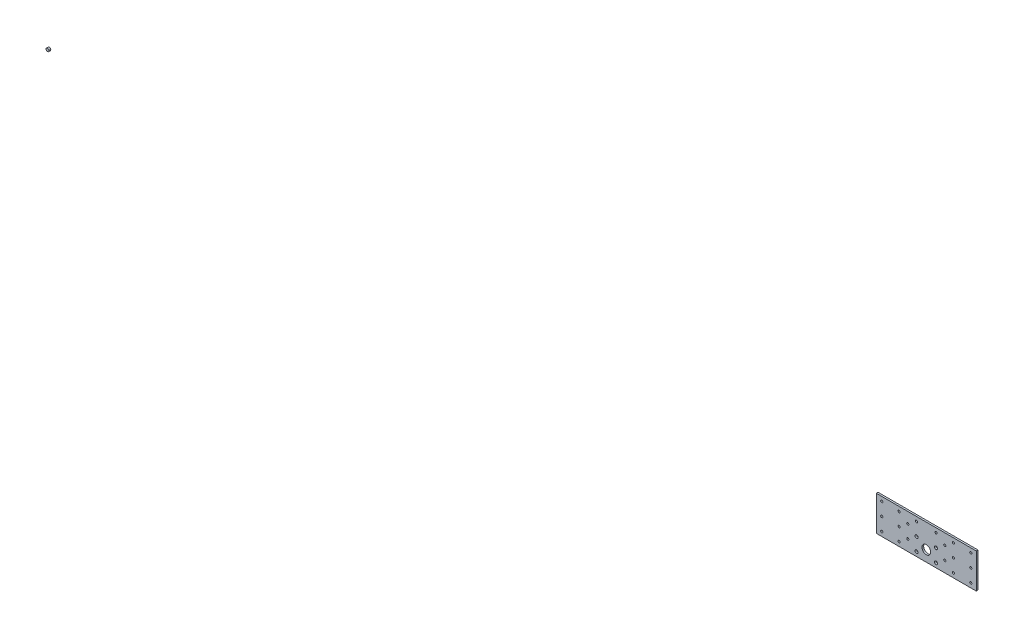
ISO-10303-21;
HEADER;
FILE_DESCRIPTION(('STEP AP214'),'2;1');
FILE_NAME('part.step','',(''),(''),'','','');
FILE_SCHEMA(('AUTOMOTIVE_DESIGN { 1 0 10303 214 1 1 1 1 }'));
ENDSEC;
DATA;
#1=APPLICATION_CONTEXT('core data for automotive mechanical design processes');
#2=APPLICATION_PROTOCOL_DEFINITION('international standard','automotive_design',2000,#1);
#3=PRODUCT_CONTEXT('',#1,'mechanical');
#4=PRODUCT('Part','Part','',(#3));
#5=PRODUCT_RELATED_PRODUCT_CATEGORY('part','',(#4));
#6=PRODUCT_DEFINITION_FORMATION('','',#4);
#7=PRODUCT_DEFINITION_CONTEXT('part definition',#1,'design');
#8=PRODUCT_DEFINITION('design','',#6,#7);
#9=PRODUCT_DEFINITION_SHAPE('','',#8);
#10=(LENGTH_UNIT() NAMED_UNIT(*) SI_UNIT(.MILLI.,.METRE.));
#11=(NAMED_UNIT(*) PLANE_ANGLE_UNIT() SI_UNIT($,.RADIAN.));
#12=(NAMED_UNIT(*) SI_UNIT($,.STERADIAN.) SOLID_ANGLE_UNIT());
#13=UNCERTAINTY_MEASURE_WITH_UNIT(LENGTH_MEASURE(1.E-05),#10,'distance_accuracy_value','');
#14=(GEOMETRIC_REPRESENTATION_CONTEXT(3) GLOBAL_UNCERTAINTY_ASSIGNED_CONTEXT((#13)) GLOBAL_UNIT_ASSIGNED_CONTEXT((#10,
#11,#12)) REPRESENTATION_CONTEXT('',''));
#15=CARTESIAN_POINT('',(0.,0.,0.));
#16=DIRECTION('',(0.,0.,1.));
#17=DIRECTION('',(1.,0.,0.));
#18=AXIS2_PLACEMENT_3D('',#15,#16,#17);
#19=CARTESIAN_POINT('',(-381.5,2.,0.8));
#20=DIRECTION('',(0.,0.,-1.));
#21=DIRECTION('',(-1.,0.,0.));
#22=AXIS2_PLACEMENT_3D('',#19,#20,#21);
#23=CYLINDRICAL_SURFACE('',#22,0.700000000000018);
#24=CARTESIAN_POINT('',(-381.5,2.,0.8));
#25=DIRECTION('',(0.,0.,1.));
#26=DIRECTION('',(1.,0.,0.));
#27=AXIS2_PLACEMENT_3D('',#24,#25,#26);
#28=CIRCLE('',#27,0.700000000000018);
#29=CARTESIAN_POINT('',(-380.8,2.,0.8));
#30=VERTEX_POINT('',#29);
#31=EDGE_CURVE('E11',#30,#30,#28,.T.);
#32=ORIENTED_EDGE('',*,*,#31,.F.);
#33=EDGE_LOOP('',(#32));
#34=FACE_BOUND('',#33,.T.);
#35=CARTESIAN_POINT('',(-381.5,2.,0.));
#36=DIRECTION('',(0.,0.,1.));
#37=DIRECTION('',(1.,0.,0.));
#38=AXIS2_PLACEMENT_3D('',#35,#36,#37);
#39=CIRCLE('',#38,0.700000000000018);
#40=CARTESIAN_POINT('',(-380.8,2.,0.));
#41=VERTEX_POINT('',#40);
#42=EDGE_CURVE('E44',#41,#41,#39,.T.);
#43=ORIENTED_EDGE('',*,*,#42,.T.);
#44=EDGE_LOOP('',(#43));
#45=FACE_BOUND('',#44,.T.);
#46=ADVANCED_FACE('F41',(#34,#45),#23,.T.);
#47=CARTESIAN_POINT('',(-381.5,2.,0.8));
#48=DIRECTION('',(0.,0.,1.));
#49=DIRECTION('',(1.,0.,0.));
#50=AXIS2_PLACEMENT_3D('',#47,#48,#49);
#51=PLANE('',#50);
#52=ORIENTED_EDGE('',*,*,#31,.T.);
#53=EDGE_LOOP('',(#52));
#54=FACE_BOUND('',#53,.T.);
#55=ADVANCED_FACE('F56',(#54),#51,.T.);
#56=CARTESIAN_POINT('',(-381.5,2.,0.));
#57=DIRECTION('',(0.,0.,1.));
#58=DIRECTION('',(1.,0.,0.));
#59=AXIS2_PLACEMENT_3D('',#56,#57,#58);
#60=PLANE('',#59);
#61=ORIENTED_EDGE('',*,*,#42,.F.);
#62=EDGE_LOOP('',(#61));
#63=FACE_BOUND('',#62,.T.);
#64=ADVANCED_FACE('F54',(#63),#60,.F.);
#65=CLOSED_SHELL('',(#46,#55,#64));
#66=MANIFOLD_SOLID_BREP('B2',#65);
#67=CARTESIAN_POINT('',(0.,0.,0.8));
#68=DIRECTION('',(0.,0.,1.));
#69=DIRECTION('',(1.,0.,0.));
#70=AXIS2_PLACEMENT_3D('',#67,#68,#69);
#71=PLANE('',#70);
#72=CARTESIAN_POINT('',(43.5,8.,0.8));
#73=DIRECTION('',(0.,0.,1.));
#74=DIRECTION('',(-1.,0.,0.));
#75=AXIS2_PLACEMENT_3D('',#72,#73,#74);
#76=CIRCLE('',#75,0.499999999999993);
#77=CARTESIAN_POINT('',(43.,8.,0.8));
#78=VERTEX_POINT('',#77);
#79=EDGE_CURVE('E281',#78,#78,#76,.T.);
#80=ORIENTED_EDGE('',*,*,#79,.F.);
#81=EDGE_LOOP('',(#80));
#82=FACE_BOUND('',#81,.T.);
#83=CARTESIAN_POINT('',(43.5,2.,0.8));
#84=DIRECTION('',(0.,0.,1.));
#85=DIRECTION('',(-1.,0.,0.));
#86=AXIS2_PLACEMENT_3D('',#83,#84,#85);
#87=CIRCLE('',#86,0.500000000000006);
#88=CARTESIAN_POINT('',(43.,2.,0.8));
#89=VERTEX_POINT('',#88);
#90=EDGE_CURVE('E293',#89,#89,#87,.T.);
#91=ORIENTED_EDGE('',*,*,#90,.F.);
#92=EDGE_LOOP('',(#91));
#93=FACE_BOUND('',#92,.T.);
#94=CARTESIAN_POINT('',(35.5,2.,0.8));
#95=DIRECTION('',(0.,0.,1.));
#96=DIRECTION('',(-1.,0.,0.));
#97=AXIS2_PLACEMENT_3D('',#94,#95,#96);
#98=CIRCLE('',#97,0.499999999999999);
#99=CARTESIAN_POINT('',(35.,2.,0.8));
#100=VERTEX_POINT('',#99);
#101=EDGE_CURVE('E305',#100,#100,#98,.T.);
#102=ORIENTED_EDGE('',*,*,#101,.F.);
#103=EDGE_LOOP('',(#102));
#104=FACE_BOUND('',#103,.T.);
#105=CARTESIAN_POINT('',(27.5,14.,0.8));
#106=DIRECTION('',(0.,0.,1.));
#107=DIRECTION('',(-1.,0.,0.));
#108=AXIS2_PLACEMENT_3D('',#105,#106,#107);
#109=CIRCLE('',#108,0.499999999999999);
#110=CARTESIAN_POINT('',(27.,14.,0.8));
#111=VERTEX_POINT('',#110);
#112=EDGE_CURVE('E317',#111,#111,#109,.T.);
#113=ORIENTED_EDGE('',*,*,#112,.F.);
#114=EDGE_LOOP('',(#113));
#115=FACE_BOUND('',#114,.T.);
#116=CARTESIAN_POINT('',(31.5,11.,0.8));
#117=DIRECTION('',(0.,0.,1.));
#118=DIRECTION('',(-1.,0.,0.));
#119=AXIS2_PLACEMENT_3D('',#116,#117,#118);
#120=CIRCLE('',#119,0.499999999999999);
#121=CARTESIAN_POINT('',(31.,11.,0.8));
#122=VERTEX_POINT('',#121);
#123=EDGE_CURVE('E329',#122,#122,#120,.T.);
#124=ORIENTED_EDGE('',*,*,#123,.F.);
#125=EDGE_LOOP('',(#124));
#126=FACE_BOUND('',#125,.T.);
#127=CARTESIAN_POINT('',(18.5,8.,0.8));
#128=DIRECTION('',(0.,0.,1.));
#129=DIRECTION('',(1.,0.,0.));
#130=AXIS2_PLACEMENT_3D('',#127,#128,#129);
#131=CIRCLE('',#130,0.699999999999998);
#132=CARTESIAN_POINT('',(19.2,8.,0.8));
#133=VERTEX_POINT('',#132);
#134=EDGE_CURVE('E341',#133,#133,#131,.T.);
#135=ORIENTED_EDGE('',*,*,#134,.F.);
#136=EDGE_LOOP('',(#135));
#137=FACE_BOUND('',#136,.T.);
#138=CARTESIAN_POINT('',(14.5,5.,0.8));
#139=DIRECTION('',(0.,0.,1.));
#140=DIRECTION('',(1.,0.,0.));
#141=AXIS2_PLACEMENT_3D('',#138,#139,#140);
#142=CIRCLE('',#141,0.500000000000001);
#143=CARTESIAN_POINT('',(15.,5.,0.8));
#144=VERTEX_POINT('',#143);
#145=EDGE_CURVE('E353',#144,#144,#142,.T.);
#146=ORIENTED_EDGE('',*,*,#145,.F.);
#147=EDGE_LOOP('',(#146));
#148=FACE_BOUND('',#147,.T.);
#149=CARTESIAN_POINT('',(18.5,14.,0.8));
#150=DIRECTION('',(0.,0.,1.));
#151=DIRECTION('',(1.,0.,0.));
#152=AXIS2_PLACEMENT_3D('',#149,#150,#151);
#153=CIRCLE('',#152,0.499999999999999);
#154=CARTESIAN_POINT('',(19.,14.,0.8));
#155=VERTEX_POINT('',#154);
#156=EDGE_CURVE('E365',#155,#155,#153,.T.);
#157=ORIENTED_EDGE('',*,*,#156,.F.);
#158=EDGE_LOOP('',(#157));
#159=FACE_BOUND('',#158,.T.);
#160=CARTESIAN_POINT('',(10.5,8.,0.8));
#161=DIRECTION('',(0.,0.,1.));
#162=DIRECTION('',(1.,0.,0.));
#163=AXIS2_PLACEMENT_3D('',#160,#161,#162);
#164=CIRCLE('',#163,0.500000000000001);
#165=CARTESIAN_POINT('',(11.,8.,0.8));
#166=VERTEX_POINT('',#165);
#167=EDGE_CURVE('E377',#166,#166,#164,.T.);
#168=ORIENTED_EDGE('',*,*,#167,.F.);
#169=EDGE_LOOP('',(#168));
#170=FACE_BOUND('',#169,.T.);
#171=CARTESIAN_POINT('',(2.5,2.,0.8));
#172=DIRECTION('',(0.,0.,1.));
#173=DIRECTION('',(1.,0.,0.));
#174=AXIS2_PLACEMENT_3D('',#171,#172,#173);
#175=CIRCLE('',#174,0.5);
#176=CARTESIAN_POINT('',(3.,2.,0.8));
#177=VERTEX_POINT('',#176);
#178=EDGE_CURVE('E389',#177,#177,#175,.T.);
#179=ORIENTED_EDGE('',*,*,#178,.F.);
#180=EDGE_LOOP('',(#179));
#181=FACE_BOUND('',#180,.T.);
#182=CARTESIAN_POINT('',(23.,5.,0.8));
#183=DIRECTION('',(0.,0.,1.));
#184=DIRECTION('',(1.,0.,0.));
#185=AXIS2_PLACEMENT_3D('',#182,#183,#184);
#186=CIRCLE('',#185,2.);
#187=CARTESIAN_POINT('',(25.,5.,0.8));
#188=VERTEX_POINT('',#187);
#189=EDGE_CURVE('E401',#188,#188,#186,.T.);
#190=ORIENTED_EDGE('',*,*,#189,.F.);
#191=EDGE_LOOP('',(#190));
#192=FACE_BOUND('',#191,.T.);
#193=DIRECTION('',(1.,0.,0.));
#194=VECTOR('',#193,1.);
#195=CARTESIAN_POINT('',(23.,0.,0.8));
#196=LINE('',#195,#194);
#197=CARTESIAN_POINT('',(0.,0.,0.8));
#198=VERTEX_POINT('',#197);
#199=CARTESIAN_POINT('',(46.,0.,0.8));
#200=VERTEX_POINT('',#199);
#201=EDGE_CURVE('E99',#198,#200,#196,.T.);
#202=ORIENTED_EDGE('',*,*,#201,.T.);
#203=DIRECTION('',(0.,1.,0.));
#204=VECTOR('',#203,1.);
#205=CARTESIAN_POINT('',(46.,0.,0.8));
#206=LINE('',#205,#204);
#207=CARTESIAN_POINT('',(46.,16.,0.8));
#208=VERTEX_POINT('',#207);
#209=EDGE_CURVE('E130',#200,#208,#206,.T.);
#210=ORIENTED_EDGE('',*,*,#209,.T.);
#211=DIRECTION('',(-1.,0.,0.));
#212=VECTOR('',#211,1.);
#213=CARTESIAN_POINT('',(46.,16.,0.8));
#214=LINE('',#213,#212);
#215=CARTESIAN_POINT('',(0.,16.,0.8));
#216=VERTEX_POINT('',#215);
#217=EDGE_CURVE('E134',#208,#216,#214,.T.);
#218=ORIENTED_EDGE('',*,*,#217,.T.);
#219=DIRECTION('',(0.,-1.,0.));
#220=VECTOR('',#219,1.);
#221=CARTESIAN_POINT('',(0.,0.,0.8));
#222=LINE('',#221,#220);
#223=EDGE_CURVE('E141',#216,#198,#222,.T.);
#224=ORIENTED_EDGE('',*,*,#223,.T.);
#225=EDGE_LOOP('',(#202,#210,#218,#224));
#226=FACE_BOUND('',#225,.T.);
#227=CARTESIAN_POINT('',(2.5,8.,0.8));
#228=DIRECTION('',(0.,0.,1.));
#229=DIRECTION('',(1.,0.,0.));
#230=AXIS2_PLACEMENT_3D('',#227,#228,#229);
#231=CIRCLE('',#230,0.5);
#232=CARTESIAN_POINT('',(3.,8.,0.8));
#233=VERTEX_POINT('',#232);
#234=EDGE_CURVE('E148',#233,#233,#231,.T.);
#235=ORIENTED_EDGE('',*,*,#234,.F.);
#236=EDGE_LOOP('',(#235));
#237=FACE_BOUND('',#236,.T.);
#238=CARTESIAN_POINT('',(2.5,14.,0.8));
#239=DIRECTION('',(0.,0.,1.));
#240=DIRECTION('',(1.,0.,0.));
#241=AXIS2_PLACEMENT_3D('',#238,#239,#240);
#242=CIRCLE('',#241,0.5);
#243=CARTESIAN_POINT('',(3.,14.,0.8));
#244=VERTEX_POINT('',#243);
#245=EDGE_CURVE('E395',#244,#244,#242,.T.);
#246=ORIENTED_EDGE('',*,*,#245,.F.);
#247=EDGE_LOOP('',(#246));
#248=FACE_BOUND('',#247,.T.);
#249=CARTESIAN_POINT('',(10.5,2.,0.8));
#250=DIRECTION('',(0.,0.,1.));
#251=DIRECTION('',(1.,0.,0.));
#252=AXIS2_PLACEMENT_3D('',#249,#250,#251);
#253=CIRCLE('',#252,0.500000000000001);
#254=CARTESIAN_POINT('',(11.,2.,0.8));
#255=VERTEX_POINT('',#254);
#256=EDGE_CURVE('E383',#255,#255,#253,.T.);
#257=ORIENTED_EDGE('',*,*,#256,.F.);
#258=EDGE_LOOP('',(#257));
#259=FACE_BOUND('',#258,.T.);
#260=CARTESIAN_POINT('',(10.5,14.,0.8));
#261=DIRECTION('',(0.,0.,1.));
#262=DIRECTION('',(1.,0.,0.));
#263=AXIS2_PLACEMENT_3D('',#260,#261,#262);
#264=CIRCLE('',#263,0.500000000000001);
#265=CARTESIAN_POINT('',(11.,14.,0.8));
#266=VERTEX_POINT('',#265);
#267=EDGE_CURVE('E371',#266,#266,#264,.T.);
#268=ORIENTED_EDGE('',*,*,#267,.F.);
#269=EDGE_LOOP('',(#268));
#270=FACE_BOUND('',#269,.T.);
#271=CARTESIAN_POINT('',(14.5,11.,0.8));
#272=DIRECTION('',(0.,0.,1.));
#273=DIRECTION('',(1.,0.,0.));
#274=AXIS2_PLACEMENT_3D('',#271,#272,#273);
#275=CIRCLE('',#274,0.500000000000001);
#276=CARTESIAN_POINT('',(15.,11.,0.8));
#277=VERTEX_POINT('',#276);
#278=EDGE_CURVE('E359',#277,#277,#275,.T.);
#279=ORIENTED_EDGE('',*,*,#278,.F.);
#280=EDGE_LOOP('',(#279));
#281=FACE_BOUND('',#280,.T.);
#282=CARTESIAN_POINT('',(18.5,2.,0.8));
#283=DIRECTION('',(0.,0.,1.));
#284=DIRECTION('',(1.,0.,0.));
#285=AXIS2_PLACEMENT_3D('',#282,#283,#284);
#286=CIRCLE('',#285,0.699999999999998);
#287=CARTESIAN_POINT('',(19.2,2.,0.8));
#288=VERTEX_POINT('',#287);
#289=EDGE_CURVE('E347',#288,#288,#286,.T.);
#290=ORIENTED_EDGE('',*,*,#289,.F.);
#291=EDGE_LOOP('',(#290));
#292=FACE_BOUND('',#291,.T.);
#293=CARTESIAN_POINT('',(27.5,2.,0.8));
#294=DIRECTION('',(0.,0.,1.));
#295=DIRECTION('',(-1.,0.,0.));
#296=AXIS2_PLACEMENT_3D('',#293,#294,#295);
#297=CIRCLE('',#296,0.699999999999998);
#298=CARTESIAN_POINT('',(26.8,2.,0.8));
#299=VERTEX_POINT('',#298);
#300=EDGE_CURVE('E335',#299,#299,#297,.T.);
#301=ORIENTED_EDGE('',*,*,#300,.F.);
#302=EDGE_LOOP('',(#301));
#303=FACE_BOUND('',#302,.T.);
#304=CARTESIAN_POINT('',(31.5,5.,0.8));
#305=DIRECTION('',(0.,0.,1.));
#306=DIRECTION('',(-1.,0.,0.));
#307=AXIS2_PLACEMENT_3D('',#304,#305,#306);
#308=CIRCLE('',#307,0.500000000000003);
#309=CARTESIAN_POINT('',(31.,5.,0.8));
#310=VERTEX_POINT('',#309);
#311=EDGE_CURVE('E323',#310,#310,#308,.T.);
#312=ORIENTED_EDGE('',*,*,#311,.F.);
#313=EDGE_LOOP('',(#312));
#314=FACE_BOUND('',#313,.T.);
#315=CARTESIAN_POINT('',(35.5,14.,0.8));
#316=DIRECTION('',(0.,0.,1.));
#317=DIRECTION('',(-1.,0.,0.));
#318=AXIS2_PLACEMENT_3D('',#315,#316,#317);
#319=CIRCLE('',#318,0.499999999999999);
#320=CARTESIAN_POINT('',(35.,14.,0.8));
#321=VERTEX_POINT('',#320);
#322=EDGE_CURVE('E311',#321,#321,#319,.T.);
#323=ORIENTED_EDGE('',*,*,#322,.F.);
#324=EDGE_LOOP('',(#323));
#325=FACE_BOUND('',#324,.T.);
#326=CARTESIAN_POINT('',(35.5,8.,0.8));
#327=DIRECTION('',(0.,0.,1.));
#328=DIRECTION('',(-1.,0.,0.));
#329=AXIS2_PLACEMENT_3D('',#326,#327,#328);
#330=CIRCLE('',#329,0.500000000000006);
#331=CARTESIAN_POINT('',(35.,8.,0.8));
#332=VERTEX_POINT('',#331);
#333=EDGE_CURVE('E299',#332,#332,#330,.T.);
#334=ORIENTED_EDGE('',*,*,#333,.F.);
#335=EDGE_LOOP('',(#334));
#336=FACE_BOUND('',#335,.T.);
#337=CARTESIAN_POINT('',(43.5,14.,0.8));
#338=DIRECTION('',(0.,0.,1.));
#339=DIRECTION('',(-1.,0.,0.));
#340=AXIS2_PLACEMENT_3D('',#337,#338,#339);
#341=CIRCLE('',#340,0.500000000000006);
#342=CARTESIAN_POINT('',(43.,14.,0.8));
#343=VERTEX_POINT('',#342);
#344=EDGE_CURVE('E287',#343,#343,#341,.T.);
#345=ORIENTED_EDGE('',*,*,#344,.F.);
#346=EDGE_LOOP('',(#345));
#347=FACE_BOUND('',#346,.T.);
#348=CARTESIAN_POINT('',(27.5,8.,0.8));
#349=DIRECTION('',(0.,0.,1.));
#350=DIRECTION('',(-1.,0.,0.));
#351=AXIS2_PLACEMENT_3D('',#348,#349,#350);
#352=CIRCLE('',#351,0.699999999999998);
#353=CARTESIAN_POINT('',(26.8,8.,0.8));
#354=VERTEX_POINT('',#353);
#355=EDGE_CURVE('E272',#354,#354,#352,.T.);
#356=ORIENTED_EDGE('',*,*,#355,.F.);
#357=EDGE_LOOP('',(#356));
#358=FACE_BOUND('',#357,.T.);
#359=ADVANCED_FACE('F82',(#82,#93,#104,#115,#126,#137,#148,#159,#170,#181,#192,#226,#237,#248,
#259,#270,#281,#292,#303,#314,#325,#336,#347,#358),#71,.T.);
#360=CARTESIAN_POINT('',(0.,0.,0.));
#361=DIRECTION('',(0.,0.,1.));
#362=DIRECTION('',(1.,0.,0.));
#363=AXIS2_PLACEMENT_3D('',#360,#361,#362);
#364=PLANE('',#363);
#365=DIRECTION('',(0.,1.,0.));
#366=VECTOR('',#365,1.);
#367=CARTESIAN_POINT('',(46.,0.,0.));
#368=LINE('',#367,#366);
#369=CARTESIAN_POINT('',(46.,0.,0.));
#370=VERTEX_POINT('',#369);
#371=CARTESIAN_POINT('',(46.,16.,0.));
#372=VERTEX_POINT('',#371);
#373=EDGE_CURVE('E137',#370,#372,#368,.T.);
#374=ORIENTED_EDGE('',*,*,#373,.F.);
#375=DIRECTION('',(1.,0.,0.));
#376=VECTOR('',#375,1.);
#377=CARTESIAN_POINT('',(23.,0.,0.));
#378=LINE('',#377,#376);
#379=CARTESIAN_POINT('',(0.,0.,0.));
#380=VERTEX_POINT('',#379);
#381=EDGE_CURVE('E151',#380,#370,#378,.T.);
#382=ORIENTED_EDGE('',*,*,#381,.F.);
#383=DIRECTION('',(0.,-1.,0.));
#384=VECTOR('',#383,1.);
#385=CARTESIAN_POINT('',(0.,0.,0.));
#386=LINE('',#385,#384);
#387=CARTESIAN_POINT('',(0.,16.,0.));
#388=VERTEX_POINT('',#387);
#389=EDGE_CURVE('E124',#388,#380,#386,.T.);
#390=ORIENTED_EDGE('',*,*,#389,.F.);
#391=DIRECTION('',(-1.,0.,0.));
#392=VECTOR('',#391,1.);
#393=CARTESIAN_POINT('',(46.,16.,0.));
#394=LINE('',#393,#392);
#395=EDGE_CURVE('E117',#372,#388,#394,.T.);
#396=ORIENTED_EDGE('',*,*,#395,.F.);
#397=EDGE_LOOP('',(#374,#382,#390,#396));
#398=FACE_BOUND('',#397,.T.);
#399=CARTESIAN_POINT('',(2.5,8.,0.));
#400=DIRECTION('',(0.,0.,1.));
#401=DIRECTION('',(1.,0.,0.));
#402=AXIS2_PLACEMENT_3D('',#399,#400,#401);
#403=CIRCLE('',#402,0.5);
#404=CARTESIAN_POINT('',(3.,8.,0.));
#405=VERTEX_POINT('',#404);
#406=EDGE_CURVE('E404',#405,#405,#403,.T.);
#407=ORIENTED_EDGE('',*,*,#406,.T.);
#408=EDGE_LOOP('',(#407));
#409=FACE_BOUND('',#408,.T.);
#410=CARTESIAN_POINT('',(23.,5.,0.));
#411=DIRECTION('',(0.,0.,1.));
#412=DIRECTION('',(1.,0.,0.));
#413=AXIS2_PLACEMENT_3D('',#410,#411,#412);
#414=CIRCLE('',#413,2.);
#415=CARTESIAN_POINT('',(25.,5.,0.));
#416=VERTEX_POINT('',#415);
#417=EDGE_CURVE('E398',#416,#416,#414,.T.);
#418=ORIENTED_EDGE('',*,*,#417,.T.);
#419=EDGE_LOOP('',(#418));
#420=FACE_BOUND('',#419,.T.);
#421=CARTESIAN_POINT('',(2.5,14.,0.));
#422=DIRECTION('',(0.,0.,1.));
#423=DIRECTION('',(1.,0.,0.));
#424=AXIS2_PLACEMENT_3D('',#421,#422,#423);
#425=CIRCLE('',#424,0.5);
#426=CARTESIAN_POINT('',(3.,14.,0.));
#427=VERTEX_POINT('',#426);
#428=EDGE_CURVE('E392',#427,#427,#425,.T.);
#429=ORIENTED_EDGE('',*,*,#428,.T.);
#430=EDGE_LOOP('',(#429));
#431=FACE_BOUND('',#430,.T.);
#432=CARTESIAN_POINT('',(2.5,2.,0.));
#433=DIRECTION('',(0.,0.,1.));
#434=DIRECTION('',(1.,0.,0.));
#435=AXIS2_PLACEMENT_3D('',#432,#433,#434);
#436=CIRCLE('',#435,0.5);
#437=CARTESIAN_POINT('',(3.,2.,0.));
#438=VERTEX_POINT('',#437);
#439=EDGE_CURVE('E386',#438,#438,#436,.T.);
#440=ORIENTED_EDGE('',*,*,#439,.T.);
#441=EDGE_LOOP('',(#440));
#442=FACE_BOUND('',#441,.T.);
#443=CARTESIAN_POINT('',(10.5,2.,0.));
#444=DIRECTION('',(0.,0.,1.));
#445=DIRECTION('',(1.,0.,0.));
#446=AXIS2_PLACEMENT_3D('',#443,#444,#445);
#447=CIRCLE('',#446,0.500000000000001);
#448=CARTESIAN_POINT('',(11.,2.,0.));
#449=VERTEX_POINT('',#448);
#450=EDGE_CURVE('E380',#449,#449,#447,.T.);
#451=ORIENTED_EDGE('',*,*,#450,.T.);
#452=EDGE_LOOP('',(#451));
#453=FACE_BOUND('',#452,.T.);
#454=CARTESIAN_POINT('',(10.5,8.,0.));
#455=DIRECTION('',(0.,0.,1.));
#456=DIRECTION('',(1.,0.,0.));
#457=AXIS2_PLACEMENT_3D('',#454,#455,#456);
#458=CIRCLE('',#457,0.500000000000001);
#459=CARTESIAN_POINT('',(11.,8.,0.));
#460=VERTEX_POINT('',#459);
#461=EDGE_CURVE('E374',#460,#460,#458,.T.);
#462=ORIENTED_EDGE('',*,*,#461,.T.);
#463=EDGE_LOOP('',(#462));
#464=FACE_BOUND('',#463,.T.);
#465=CARTESIAN_POINT('',(10.5,14.,0.));
#466=DIRECTION('',(0.,0.,1.));
#467=DIRECTION('',(1.,0.,0.));
#468=AXIS2_PLACEMENT_3D('',#465,#466,#467);
#469=CIRCLE('',#468,0.500000000000001);
#470=CARTESIAN_POINT('',(11.,14.,0.));
#471=VERTEX_POINT('',#470);
#472=EDGE_CURVE('E368',#471,#471,#469,.T.);
#473=ORIENTED_EDGE('',*,*,#472,.T.);
#474=EDGE_LOOP('',(#473));
#475=FACE_BOUND('',#474,.T.);
#476=CARTESIAN_POINT('',(18.5,14.,0.));
#477=DIRECTION('',(0.,0.,1.));
#478=DIRECTION('',(1.,0.,0.));
#479=AXIS2_PLACEMENT_3D('',#476,#477,#478);
#480=CIRCLE('',#479,0.499999999999999);
#481=CARTESIAN_POINT('',(19.,14.,0.));
#482=VERTEX_POINT('',#481);
#483=EDGE_CURVE('E362',#482,#482,#480,.T.);
#484=ORIENTED_EDGE('',*,*,#483,.T.);
#485=EDGE_LOOP('',(#484));
#486=FACE_BOUND('',#485,.T.);
#487=CARTESIAN_POINT('',(14.5,11.,0.));
#488=DIRECTION('',(0.,0.,1.));
#489=DIRECTION('',(1.,0.,0.));
#490=AXIS2_PLACEMENT_3D('',#487,#488,#489);
#491=CIRCLE('',#490,0.500000000000001);
#492=CARTESIAN_POINT('',(15.,11.,0.));
#493=VERTEX_POINT('',#492);
#494=EDGE_CURVE('E356',#493,#493,#491,.T.);
#495=ORIENTED_EDGE('',*,*,#494,.T.);
#496=EDGE_LOOP('',(#495));
#497=FACE_BOUND('',#496,.T.);
#498=CARTESIAN_POINT('',(14.5,5.,0.));
#499=DIRECTION('',(0.,0.,1.));
#500=DIRECTION('',(1.,0.,0.));
#501=AXIS2_PLACEMENT_3D('',#498,#499,#500);
#502=CIRCLE('',#501,0.500000000000001);
#503=CARTESIAN_POINT('',(15.,5.,0.));
#504=VERTEX_POINT('',#503);
#505=EDGE_CURVE('E350',#504,#504,#502,.T.);
#506=ORIENTED_EDGE('',*,*,#505,.T.);
#507=EDGE_LOOP('',(#506));
#508=FACE_BOUND('',#507,.T.);
#509=CARTESIAN_POINT('',(18.5,2.,0.));
#510=DIRECTION('',(0.,0.,1.));
#511=DIRECTION('',(1.,0.,0.));
#512=AXIS2_PLACEMENT_3D('',#509,#510,#511);
#513=CIRCLE('',#512,0.699999999999998);
#514=CARTESIAN_POINT('',(19.2,2.,0.));
#515=VERTEX_POINT('',#514);
#516=EDGE_CURVE('E344',#515,#515,#513,.T.);
#517=ORIENTED_EDGE('',*,*,#516,.T.);
#518=EDGE_LOOP('',(#517));
#519=FACE_BOUND('',#518,.T.);
#520=CARTESIAN_POINT('',(18.5,8.,0.));
#521=DIRECTION('',(0.,0.,1.));
#522=DIRECTION('',(1.,0.,0.));
#523=AXIS2_PLACEMENT_3D('',#520,#521,#522);
#524=CIRCLE('',#523,0.699999999999998);
#525=CARTESIAN_POINT('',(19.2,8.,0.));
#526=VERTEX_POINT('',#525);
#527=EDGE_CURVE('E338',#526,#526,#524,.T.);
#528=ORIENTED_EDGE('',*,*,#527,.T.);
#529=EDGE_LOOP('',(#528));
#530=FACE_BOUND('',#529,.T.);
#531=CARTESIAN_POINT('',(27.5,2.,0.));
#532=DIRECTION('',(0.,0.,1.));
#533=DIRECTION('',(-1.,0.,0.));
#534=AXIS2_PLACEMENT_3D('',#531,#532,#533);
#535=CIRCLE('',#534,0.699999999999998);
#536=CARTESIAN_POINT('',(26.8,2.,0.));
#537=VERTEX_POINT('',#536);
#538=EDGE_CURVE('E332',#537,#537,#535,.T.);
#539=ORIENTED_EDGE('',*,*,#538,.T.);
#540=EDGE_LOOP('',(#539));
#541=FACE_BOUND('',#540,.T.);
#542=CARTESIAN_POINT('',(31.5,11.,0.));
#543=DIRECTION('',(0.,0.,1.));
#544=DIRECTION('',(-1.,0.,0.));
#545=AXIS2_PLACEMENT_3D('',#542,#543,#544);
#546=CIRCLE('',#545,0.499999999999999);
#547=CARTESIAN_POINT('',(31.,11.,0.));
#548=VERTEX_POINT('',#547);
#549=EDGE_CURVE('E326',#548,#548,#546,.T.);
#550=ORIENTED_EDGE('',*,*,#549,.T.);
#551=EDGE_LOOP('',(#550));
#552=FACE_BOUND('',#551,.T.);
#553=CARTESIAN_POINT('',(31.5,5.,0.));
#554=DIRECTION('',(0.,0.,1.));
#555=DIRECTION('',(-1.,0.,0.));
#556=AXIS2_PLACEMENT_3D('',#553,#554,#555);
#557=CIRCLE('',#556,0.500000000000003);
#558=CARTESIAN_POINT('',(31.,5.,0.));
#559=VERTEX_POINT('',#558);
#560=EDGE_CURVE('E320',#559,#559,#557,.T.);
#561=ORIENTED_EDGE('',*,*,#560,.T.);
#562=EDGE_LOOP('',(#561));
#563=FACE_BOUND('',#562,.T.);
#564=CARTESIAN_POINT('',(27.5,14.,0.));
#565=DIRECTION('',(0.,0.,1.));
#566=DIRECTION('',(-1.,0.,0.));
#567=AXIS2_PLACEMENT_3D('',#564,#565,#566);
#568=CIRCLE('',#567,0.499999999999999);
#569=CARTESIAN_POINT('',(27.,14.,0.));
#570=VERTEX_POINT('',#569);
#571=EDGE_CURVE('E314',#570,#570,#568,.T.);
#572=ORIENTED_EDGE('',*,*,#571,.T.);
#573=EDGE_LOOP('',(#572));
#574=FACE_BOUND('',#573,.T.);
#575=CARTESIAN_POINT('',(35.5,14.,0.));
#576=DIRECTION('',(0.,0.,1.));
#577=DIRECTION('',(-1.,0.,0.));
#578=AXIS2_PLACEMENT_3D('',#575,#576,#577);
#579=CIRCLE('',#578,0.499999999999999);
#580=CARTESIAN_POINT('',(35.,14.,0.));
#581=VERTEX_POINT('',#580);
#582=EDGE_CURVE('E308',#581,#581,#579,.T.);
#583=ORIENTED_EDGE('',*,*,#582,.T.);
#584=EDGE_LOOP('',(#583));
#585=FACE_BOUND('',#584,.T.);
#586=CARTESIAN_POINT('',(35.5,2.,0.));
#587=DIRECTION('',(0.,0.,1.));
#588=DIRECTION('',(-1.,0.,0.));
#589=AXIS2_PLACEMENT_3D('',#586,#587,#588);
#590=CIRCLE('',#589,0.499999999999999);
#591=CARTESIAN_POINT('',(35.,2.,0.));
#592=VERTEX_POINT('',#591);
#593=EDGE_CURVE('E302',#592,#592,#590,.T.);
#594=ORIENTED_EDGE('',*,*,#593,.T.);
#595=EDGE_LOOP('',(#594));
#596=FACE_BOUND('',#595,.T.);
#597=CARTESIAN_POINT('',(35.5,8.,0.));
#598=DIRECTION('',(0.,0.,1.));
#599=DIRECTION('',(-1.,0.,0.));
#600=AXIS2_PLACEMENT_3D('',#597,#598,#599);
#601=CIRCLE('',#600,0.500000000000006);
#602=CARTESIAN_POINT('',(35.,8.,0.));
#603=VERTEX_POINT('',#602);
#604=EDGE_CURVE('E296',#603,#603,#601,.T.);
#605=ORIENTED_EDGE('',*,*,#604,.T.);
#606=EDGE_LOOP('',(#605));
#607=FACE_BOUND('',#606,.T.);
#608=CARTESIAN_POINT('',(43.5,2.,0.));
#609=DIRECTION('',(0.,0.,1.));
#610=DIRECTION('',(-1.,0.,0.));
#611=AXIS2_PLACEMENT_3D('',#608,#609,#610);
#612=CIRCLE('',#611,0.500000000000006);
#613=CARTESIAN_POINT('',(43.,2.,0.));
#614=VERTEX_POINT('',#613);
#615=EDGE_CURVE('E290',#614,#614,#612,.T.);
#616=ORIENTED_EDGE('',*,*,#615,.T.);
#617=EDGE_LOOP('',(#616));
#618=FACE_BOUND('',#617,.T.);
#619=CARTESIAN_POINT('',(43.5,14.,0.));
#620=DIRECTION('',(0.,0.,1.));
#621=DIRECTION('',(-1.,0.,0.));
#622=AXIS2_PLACEMENT_3D('',#619,#620,#621);
#623=CIRCLE('',#622,0.500000000000006);
#624=CARTESIAN_POINT('',(43.,14.,0.));
#625=VERTEX_POINT('',#624);
#626=EDGE_CURVE('E284',#625,#625,#623,.T.);
#627=ORIENTED_EDGE('',*,*,#626,.T.);
#628=EDGE_LOOP('',(#627));
#629=FACE_BOUND('',#628,.T.);
#630=CARTESIAN_POINT('',(43.5,8.,0.));
#631=DIRECTION('',(0.,0.,1.));
#632=DIRECTION('',(-1.,0.,0.));
#633=AXIS2_PLACEMENT_3D('',#630,#631,#632);
#634=CIRCLE('',#633,0.499999999999993);
#635=CARTESIAN_POINT('',(43.,8.,0.));
#636=VERTEX_POINT('',#635);
#637=EDGE_CURVE('E278',#636,#636,#634,.T.);
#638=ORIENTED_EDGE('',*,*,#637,.T.);
#639=EDGE_LOOP('',(#638));
#640=FACE_BOUND('',#639,.T.);
#641=CARTESIAN_POINT('',(27.5,8.,0.));
#642=DIRECTION('',(0.,0.,1.));
#643=DIRECTION('',(-1.,0.,0.));
#644=AXIS2_PLACEMENT_3D('',#641,#642,#643);
#645=CIRCLE('',#644,0.699999999999998);
#646=CARTESIAN_POINT('',(26.8,8.,0.));
#647=VERTEX_POINT('',#646);
#648=EDGE_CURVE('E275',#647,#647,#645,.T.);
#649=ORIENTED_EDGE('',*,*,#648,.T.);
#650=EDGE_LOOP('',(#649));
#651=FACE_BOUND('',#650,.T.);
#652=ADVANCED_FACE('F157',(#398,#409,#420,#431,#442,#453,#464,#475,#486,#497,#508,#519,#530,
#541,#552,#563,#574,#585,#596,#607,#618,#629,#640,#651),#364,.F.);
#653=CARTESIAN_POINT('',(46.,0.,0.8));
#654=DIRECTION('',(-1.,0.,0.));
#655=DIRECTION('',(0.,0.,1.));
#656=AXIS2_PLACEMENT_3D('',#653,#654,#655);
#657=PLANE('',#656);
#658=ORIENTED_EDGE('',*,*,#373,.T.);
#659=DIRECTION('',(0.,0.,-1.));
#660=VECTOR('',#659,1.);
#661=CARTESIAN_POINT('',(46.,16.,0.8));
#662=LINE('',#661,#660);
#663=EDGE_CURVE('E91',#208,#372,#662,.T.);
#664=ORIENTED_EDGE('',*,*,#663,.F.);
#665=ORIENTED_EDGE('',*,*,#209,.F.);
#666=DIRECTION('',(0.,0.,-1.));
#667=VECTOR('',#666,1.);
#668=CARTESIAN_POINT('',(46.,0.,0.8));
#669=LINE('',#668,#667);
#670=EDGE_CURVE('E39',#200,#370,#669,.T.);
#671=ORIENTED_EDGE('',*,*,#670,.T.);
#672=EDGE_LOOP('',(#658,#664,#665,#671));
#673=FACE_BOUND('',#672,.T.);
#674=ADVANCED_FACE('F84',(#673),#657,.F.);
#675=CARTESIAN_POINT('',(46.,16.,0.8));
#676=DIRECTION('',(0.,-1.,0.));
#677=DIRECTION('',(0.,0.,-1.));
#678=AXIS2_PLACEMENT_3D('',#675,#676,#677);
#679=PLANE('',#678);
#680=ORIENTED_EDGE('',*,*,#395,.T.);
#681=DIRECTION('',(0.,0.,-1.));
#682=VECTOR('',#681,1.);
#683=CARTESIAN_POINT('',(0.,16.,0.8));
#684=LINE('',#683,#682);
#685=EDGE_CURVE('E138',#216,#388,#684,.T.);
#686=ORIENTED_EDGE('',*,*,#685,.F.);
#687=ORIENTED_EDGE('',*,*,#217,.F.);
#688=ORIENTED_EDGE('',*,*,#663,.T.);
#689=EDGE_LOOP('',(#680,#686,#687,#688));
#690=FACE_BOUND('',#689,.T.);
#691=ADVANCED_FACE('F139',(#690),#679,.F.);
#692=CARTESIAN_POINT('',(0.,0.,0.8));
#693=DIRECTION('',(1.,0.,0.));
#694=DIRECTION('',(0.,0.,-1.));
#695=AXIS2_PLACEMENT_3D('',#692,#693,#694);
#696=PLANE('',#695);
#697=ORIENTED_EDGE('',*,*,#389,.T.);
#698=DIRECTION('',(0.,0.,-1.));
#699=VECTOR('',#698,1.);
#700=CARTESIAN_POINT('',(0.,0.,0.8));
#701=LINE('',#700,#699);
#702=EDGE_CURVE('E143',#198,#380,#701,.T.);
#703=ORIENTED_EDGE('',*,*,#702,.F.);
#704=ORIENTED_EDGE('',*,*,#223,.F.);
#705=ORIENTED_EDGE('',*,*,#685,.T.);
#706=EDGE_LOOP('',(#697,#703,#704,#705));
#707=FACE_BOUND('',#706,.T.);
#708=ADVANCED_FACE('F154',(#707),#696,.F.);
#709=CARTESIAN_POINT('',(23.,0.,0.8));
#710=DIRECTION('',(0.,1.,0.));
#711=DIRECTION('',(0.,0.,1.));
#712=AXIS2_PLACEMENT_3D('',#709,#710,#711);
#713=PLANE('',#712);
#714=ORIENTED_EDGE('',*,*,#381,.T.);
#715=ORIENTED_EDGE('',*,*,#670,.F.);
#716=ORIENTED_EDGE('',*,*,#201,.F.);
#717=ORIENTED_EDGE('',*,*,#702,.T.);
#718=EDGE_LOOP('',(#714,#715,#716,#717));
#719=FACE_BOUND('',#718,.T.);
#720=ADVANCED_FACE('F159',(#719),#713,.F.);
#721=CARTESIAN_POINT('',(2.5,8.,0.8));
#722=DIRECTION('',(0.,0.,-1.));
#723=DIRECTION('',(-1.,0.,0.));
#724=AXIS2_PLACEMENT_3D('',#721,#722,#723);
#725=CYLINDRICAL_SURFACE('',#724,0.5);
#726=ORIENTED_EDGE('',*,*,#234,.T.);
#727=EDGE_LOOP('',(#726));
#728=FACE_BOUND('',#727,.T.);
#729=ORIENTED_EDGE('',*,*,#406,.F.);
#730=EDGE_LOOP('',(#729));
#731=FACE_BOUND('',#730,.T.);
#732=ADVANCED_FACE('F161',(#728,#731),#725,.F.);
#733=CARTESIAN_POINT('',(23.,5.,0.8));
#734=DIRECTION('',(0.,0.,-1.));
#735=DIRECTION('',(-1.,0.,0.));
#736=AXIS2_PLACEMENT_3D('',#733,#734,#735);
#737=CYLINDRICAL_SURFACE('',#736,2.);
#738=ORIENTED_EDGE('',*,*,#189,.T.);
#739=EDGE_LOOP('',(#738));
#740=FACE_BOUND('',#739,.T.);
#741=ORIENTED_EDGE('',*,*,#417,.F.);
#742=EDGE_LOOP('',(#741));
#743=FACE_BOUND('',#742,.T.);
#744=ADVANCED_FACE('F167',(#740,#743),#737,.F.);
#745=CARTESIAN_POINT('',(2.5,14.,0.8));
#746=DIRECTION('',(0.,0.,-1.));
#747=DIRECTION('',(-1.,0.,0.));
#748=AXIS2_PLACEMENT_3D('',#745,#746,#747);
#749=CYLINDRICAL_SURFACE('',#748,0.5);
#750=ORIENTED_EDGE('',*,*,#245,.T.);
#751=EDGE_LOOP('',(#750));
#752=FACE_BOUND('',#751,.T.);
#753=ORIENTED_EDGE('',*,*,#428,.F.);
#754=EDGE_LOOP('',(#753));
#755=FACE_BOUND('',#754,.T.);
#756=ADVANCED_FACE('F183',(#752,#755),#749,.F.);
#757=CARTESIAN_POINT('',(2.5,2.,0.8));
#758=DIRECTION('',(0.,0.,-1.));
#759=DIRECTION('',(-1.,0.,0.));
#760=AXIS2_PLACEMENT_3D('',#757,#758,#759);
#761=CYLINDRICAL_SURFACE('',#760,0.5);
#762=ORIENTED_EDGE('',*,*,#178,.T.);
#763=EDGE_LOOP('',(#762));
#764=FACE_BOUND('',#763,.T.);
#765=ORIENTED_EDGE('',*,*,#439,.F.);
#766=EDGE_LOOP('',(#765));
#767=FACE_BOUND('',#766,.T.);
#768=ADVANCED_FACE('F187',(#764,#767),#761,.F.);
#769=CARTESIAN_POINT('',(10.5,2.,0.8));
#770=DIRECTION('',(0.,0.,-1.));
#771=DIRECTION('',(-1.,0.,0.));
#772=AXIS2_PLACEMENT_3D('',#769,#770,#771);
#773=CYLINDRICAL_SURFACE('',#772,0.500000000000001);
#774=ORIENTED_EDGE('',*,*,#256,.T.);
#775=EDGE_LOOP('',(#774));
#776=FACE_BOUND('',#775,.T.);
#777=ORIENTED_EDGE('',*,*,#450,.F.);
#778=EDGE_LOOP('',(#777));
#779=FACE_BOUND('',#778,.T.);
#780=ADVANCED_FACE('F191',(#776,#779),#773,.F.);
#781=CARTESIAN_POINT('',(10.5,8.,0.8));
#782=DIRECTION('',(0.,0.,-1.));
#783=DIRECTION('',(-1.,0.,0.));
#784=AXIS2_PLACEMENT_3D('',#781,#782,#783);
#785=CYLINDRICAL_SURFACE('',#784,0.500000000000001);
#786=ORIENTED_EDGE('',*,*,#167,.T.);
#787=EDGE_LOOP('',(#786));
#788=FACE_BOUND('',#787,.T.);
#789=ORIENTED_EDGE('',*,*,#461,.F.);
#790=EDGE_LOOP('',(#789));
#791=FACE_BOUND('',#790,.T.);
#792=ADVANCED_FACE('F195',(#788,#791),#785,.F.);
#793=CARTESIAN_POINT('',(10.5,14.,0.8));
#794=DIRECTION('',(0.,0.,-1.));
#795=DIRECTION('',(-1.,0.,0.));
#796=AXIS2_PLACEMENT_3D('',#793,#794,#795);
#797=CYLINDRICAL_SURFACE('',#796,0.500000000000001);
#798=ORIENTED_EDGE('',*,*,#267,.T.);
#799=EDGE_LOOP('',(#798));
#800=FACE_BOUND('',#799,.T.);
#801=ORIENTED_EDGE('',*,*,#472,.F.);
#802=EDGE_LOOP('',(#801));
#803=FACE_BOUND('',#802,.T.);
#804=ADVANCED_FACE('F199',(#800,#803),#797,.F.);
#805=CARTESIAN_POINT('',(18.5,14.,0.8));
#806=DIRECTION('',(0.,0.,-1.));
#807=DIRECTION('',(-1.,0.,0.));
#808=AXIS2_PLACEMENT_3D('',#805,#806,#807);
#809=CYLINDRICAL_SURFACE('',#808,0.499999999999999);
#810=ORIENTED_EDGE('',*,*,#156,.T.);
#811=EDGE_LOOP('',(#810));
#812=FACE_BOUND('',#811,.T.);
#813=ORIENTED_EDGE('',*,*,#483,.F.);
#814=EDGE_LOOP('',(#813));
#815=FACE_BOUND('',#814,.T.);
#816=ADVANCED_FACE('F203',(#812,#815),#809,.F.);
#817=CARTESIAN_POINT('',(14.5,11.,0.8));
#818=DIRECTION('',(0.,0.,-1.));
#819=DIRECTION('',(-1.,0.,0.));
#820=AXIS2_PLACEMENT_3D('',#817,#818,#819);
#821=CYLINDRICAL_SURFACE('',#820,0.500000000000001);
#822=ORIENTED_EDGE('',*,*,#278,.T.);
#823=EDGE_LOOP('',(#822));
#824=FACE_BOUND('',#823,.T.);
#825=ORIENTED_EDGE('',*,*,#494,.F.);
#826=EDGE_LOOP('',(#825));
#827=FACE_BOUND('',#826,.T.);
#828=ADVANCED_FACE('F207',(#824,#827),#821,.F.);
#829=CARTESIAN_POINT('',(14.5,5.,0.8));
#830=DIRECTION('',(0.,0.,-1.));
#831=DIRECTION('',(-1.,0.,0.));
#832=AXIS2_PLACEMENT_3D('',#829,#830,#831);
#833=CYLINDRICAL_SURFACE('',#832,0.500000000000001);
#834=ORIENTED_EDGE('',*,*,#145,.T.);
#835=EDGE_LOOP('',(#834));
#836=FACE_BOUND('',#835,.T.);
#837=ORIENTED_EDGE('',*,*,#505,.F.);
#838=EDGE_LOOP('',(#837));
#839=FACE_BOUND('',#838,.T.);
#840=ADVANCED_FACE('F211',(#836,#839),#833,.F.);
#841=CARTESIAN_POINT('',(18.5,2.,0.8));
#842=DIRECTION('',(0.,0.,-1.));
#843=DIRECTION('',(-1.,0.,0.));
#844=AXIS2_PLACEMENT_3D('',#841,#842,#843);
#845=CYLINDRICAL_SURFACE('',#844,0.699999999999998);
#846=ORIENTED_EDGE('',*,*,#289,.T.);
#847=EDGE_LOOP('',(#846));
#848=FACE_BOUND('',#847,.T.);
#849=ORIENTED_EDGE('',*,*,#516,.F.);
#850=EDGE_LOOP('',(#849));
#851=FACE_BOUND('',#850,.T.);
#852=ADVANCED_FACE('F215',(#848,#851),#845,.F.);
#853=CARTESIAN_POINT('',(18.5,8.,0.8));
#854=DIRECTION('',(0.,0.,-1.));
#855=DIRECTION('',(-1.,0.,0.));
#856=AXIS2_PLACEMENT_3D('',#853,#854,#855);
#857=CYLINDRICAL_SURFACE('',#856,0.699999999999998);
#858=ORIENTED_EDGE('',*,*,#134,.T.);
#859=EDGE_LOOP('',(#858));
#860=FACE_BOUND('',#859,.T.);
#861=ORIENTED_EDGE('',*,*,#527,.F.);
#862=EDGE_LOOP('',(#861));
#863=FACE_BOUND('',#862,.T.);
#864=ADVANCED_FACE('F219',(#860,#863),#857,.F.);
#865=CARTESIAN_POINT('',(27.5,2.,0.8));
#866=DIRECTION('',(0.,0.,-1.));
#867=DIRECTION('',(-1.,0.,0.));
#868=AXIS2_PLACEMENT_3D('',#865,#866,#867);
#869=CYLINDRICAL_SURFACE('',#868,0.699999999999998);
#870=ORIENTED_EDGE('',*,*,#300,.T.);
#871=EDGE_LOOP('',(#870));
#872=FACE_BOUND('',#871,.T.);
#873=ORIENTED_EDGE('',*,*,#538,.F.);
#874=EDGE_LOOP('',(#873));
#875=FACE_BOUND('',#874,.T.);
#876=ADVANCED_FACE('F223',(#872,#875),#869,.F.);
#877=CARTESIAN_POINT('',(31.5,11.,0.8));
#878=DIRECTION('',(0.,0.,-1.));
#879=DIRECTION('',(-1.,0.,0.));
#880=AXIS2_PLACEMENT_3D('',#877,#878,#879);
#881=CYLINDRICAL_SURFACE('',#880,0.499999999999999);
#882=ORIENTED_EDGE('',*,*,#123,.T.);
#883=EDGE_LOOP('',(#882));
#884=FACE_BOUND('',#883,.T.);
#885=ORIENTED_EDGE('',*,*,#549,.F.);
#886=EDGE_LOOP('',(#885));
#887=FACE_BOUND('',#886,.T.);
#888=ADVANCED_FACE('F227',(#884,#887),#881,.F.);
#889=CARTESIAN_POINT('',(31.5,5.,0.8));
#890=DIRECTION('',(0.,0.,-1.));
#891=DIRECTION('',(-1.,0.,0.));
#892=AXIS2_PLACEMENT_3D('',#889,#890,#891);
#893=CYLINDRICAL_SURFACE('',#892,0.500000000000003);
#894=ORIENTED_EDGE('',*,*,#311,.T.);
#895=EDGE_LOOP('',(#894));
#896=FACE_BOUND('',#895,.T.);
#897=ORIENTED_EDGE('',*,*,#560,.F.);
#898=EDGE_LOOP('',(#897));
#899=FACE_BOUND('',#898,.T.);
#900=ADVANCED_FACE('F231',(#896,#899),#893,.F.);
#901=CARTESIAN_POINT('',(27.5,14.,0.8));
#902=DIRECTION('',(0.,0.,-1.));
#903=DIRECTION('',(-1.,0.,0.));
#904=AXIS2_PLACEMENT_3D('',#901,#902,#903);
#905=CYLINDRICAL_SURFACE('',#904,0.499999999999999);
#906=ORIENTED_EDGE('',*,*,#112,.T.);
#907=EDGE_LOOP('',(#906));
#908=FACE_BOUND('',#907,.T.);
#909=ORIENTED_EDGE('',*,*,#571,.F.);
#910=EDGE_LOOP('',(#909));
#911=FACE_BOUND('',#910,.T.);
#912=ADVANCED_FACE('F235',(#908,#911),#905,.F.);
#913=CARTESIAN_POINT('',(35.5,14.,0.8));
#914=DIRECTION('',(0.,0.,-1.));
#915=DIRECTION('',(-1.,0.,0.));
#916=AXIS2_PLACEMENT_3D('',#913,#914,#915);
#917=CYLINDRICAL_SURFACE('',#916,0.499999999999999);
#918=ORIENTED_EDGE('',*,*,#322,.T.);
#919=EDGE_LOOP('',(#918));
#920=FACE_BOUND('',#919,.T.);
#921=ORIENTED_EDGE('',*,*,#582,.F.);
#922=EDGE_LOOP('',(#921));
#923=FACE_BOUND('',#922,.T.);
#924=ADVANCED_FACE('F239',(#920,#923),#917,.F.);
#925=CARTESIAN_POINT('',(35.5,2.,0.8));
#926=DIRECTION('',(0.,0.,-1.));
#927=DIRECTION('',(-1.,0.,0.));
#928=AXIS2_PLACEMENT_3D('',#925,#926,#927);
#929=CYLINDRICAL_SURFACE('',#928,0.499999999999999);
#930=ORIENTED_EDGE('',*,*,#101,.T.);
#931=EDGE_LOOP('',(#930));
#932=FACE_BOUND('',#931,.T.);
#933=ORIENTED_EDGE('',*,*,#593,.F.);
#934=EDGE_LOOP('',(#933));
#935=FACE_BOUND('',#934,.T.);
#936=ADVANCED_FACE('F243',(#932,#935),#929,.F.);
#937=CARTESIAN_POINT('',(35.5,8.,0.8));
#938=DIRECTION('',(0.,0.,-1.));
#939=DIRECTION('',(-1.,0.,0.));
#940=AXIS2_PLACEMENT_3D('',#937,#938,#939);
#941=CYLINDRICAL_SURFACE('',#940,0.500000000000006);
#942=ORIENTED_EDGE('',*,*,#333,.T.);
#943=EDGE_LOOP('',(#942));
#944=FACE_BOUND('',#943,.T.);
#945=ORIENTED_EDGE('',*,*,#604,.F.);
#946=EDGE_LOOP('',(#945));
#947=FACE_BOUND('',#946,.T.);
#948=ADVANCED_FACE('F247',(#944,#947),#941,.F.);
#949=CARTESIAN_POINT('',(43.5,2.,0.8));
#950=DIRECTION('',(0.,0.,-1.));
#951=DIRECTION('',(-1.,0.,0.));
#952=AXIS2_PLACEMENT_3D('',#949,#950,#951);
#953=CYLINDRICAL_SURFACE('',#952,0.500000000000006);
#954=ORIENTED_EDGE('',*,*,#90,.T.);
#955=EDGE_LOOP('',(#954));
#956=FACE_BOUND('',#955,.T.);
#957=ORIENTED_EDGE('',*,*,#615,.F.);
#958=EDGE_LOOP('',(#957));
#959=FACE_BOUND('',#958,.T.);
#960=ADVANCED_FACE('F251',(#956,#959),#953,.F.);
#961=CARTESIAN_POINT('',(43.5,14.,0.8));
#962=DIRECTION('',(0.,0.,-1.));
#963=DIRECTION('',(-1.,0.,0.));
#964=AXIS2_PLACEMENT_3D('',#961,#962,#963);
#965=CYLINDRICAL_SURFACE('',#964,0.500000000000006);
#966=ORIENTED_EDGE('',*,*,#344,.T.);
#967=EDGE_LOOP('',(#966));
#968=FACE_BOUND('',#967,.T.);
#969=ORIENTED_EDGE('',*,*,#626,.F.);
#970=EDGE_LOOP('',(#969));
#971=FACE_BOUND('',#970,.T.);
#972=ADVANCED_FACE('F255',(#968,#971),#965,.F.);
#973=CARTESIAN_POINT('',(43.5,8.,0.8));
#974=DIRECTION('',(0.,0.,-1.));
#975=DIRECTION('',(-1.,0.,0.));
#976=AXIS2_PLACEMENT_3D('',#973,#974,#975);
#977=CYLINDRICAL_SURFACE('',#976,0.499999999999993);
#978=ORIENTED_EDGE('',*,*,#79,.T.);
#979=EDGE_LOOP('',(#978));
#980=FACE_BOUND('',#979,.T.);
#981=ORIENTED_EDGE('',*,*,#637,.F.);
#982=EDGE_LOOP('',(#981));
#983=FACE_BOUND('',#982,.T.);
#984=ADVANCED_FACE('F259',(#980,#983),#977,.F.);
#985=CARTESIAN_POINT('',(27.5,8.,0.8));
#986=DIRECTION('',(0.,0.,-1.));
#987=DIRECTION('',(-1.,0.,0.));
#988=AXIS2_PLACEMENT_3D('',#985,#986,#987);
#989=CYLINDRICAL_SURFACE('',#988,0.699999999999998);
#990=ORIENTED_EDGE('',*,*,#355,.T.);
#991=EDGE_LOOP('',(#990));
#992=FACE_BOUND('',#991,.T.);
#993=ORIENTED_EDGE('',*,*,#648,.F.);
#994=EDGE_LOOP('',(#993));
#995=FACE_BOUND('',#994,.T.);
#996=ADVANCED_FACE('F263',(#992,#995),#989,.F.);
#997=CLOSED_SHELL('',(#359,#652,#674,#691,#708,#720,#732,#744,#756,#768,#780,#792,#804,#816,
#828,#840,#852,#864,#876,#888,#900,#912,#924,#936,#948,#960,#972,#984,#996));
#998=MANIFOLD_SOLID_BREP('B6',#997);
#999=ADVANCED_BREP_SHAPE_REPRESENTATION('',(#18,#66,#998),#14);
#1000=SHAPE_DEFINITION_REPRESENTATION(#9,#999);
ENDSEC;
END-ISO-10303-21;
